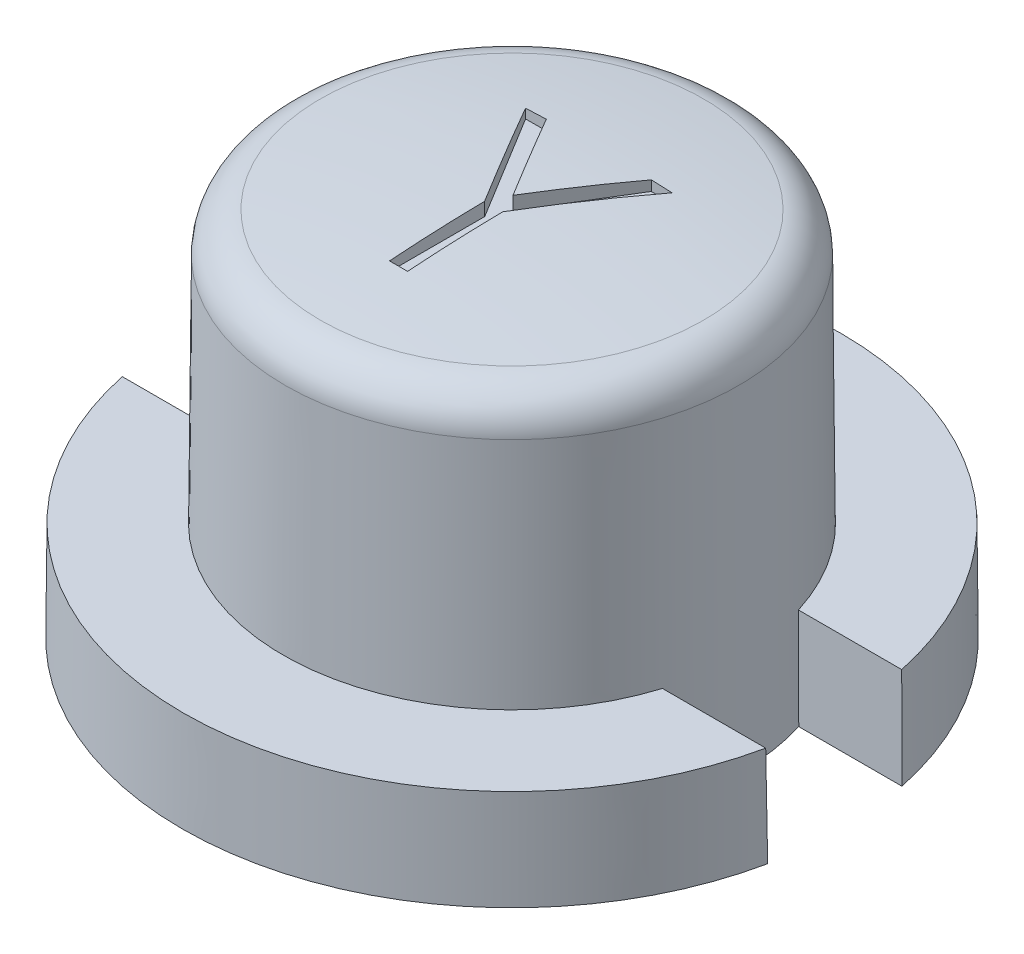
ISO-10303-21;
HEADER;
FILE_DESCRIPTION(('STEP AP214'),'2;1');
FILE_NAME('part.step','',(''),(''),'','','');
FILE_SCHEMA(('AUTOMOTIVE_DESIGN { 1 0 10303 214 1 1 1 1 }'));
ENDSEC;
DATA;
#1=APPLICATION_CONTEXT('core data for automotive mechanical design processes');
#2=APPLICATION_PROTOCOL_DEFINITION('international standard','automotive_design',2000,#1);
#3=PRODUCT_CONTEXT('',#1,'mechanical');
#4=PRODUCT('Part','Part','',(#3));
#5=PRODUCT_RELATED_PRODUCT_CATEGORY('part','',(#4));
#6=PRODUCT_DEFINITION_FORMATION('','',#4);
#7=PRODUCT_DEFINITION_CONTEXT('part definition',#1,'design');
#8=PRODUCT_DEFINITION('design','',#6,#7);
#9=PRODUCT_DEFINITION_SHAPE('','',#8);
#10=(LENGTH_UNIT() NAMED_UNIT(*) SI_UNIT(.MILLI.,.METRE.));
#11=(NAMED_UNIT(*) PLANE_ANGLE_UNIT() SI_UNIT($,.RADIAN.));
#12=(NAMED_UNIT(*) SI_UNIT($,.STERADIAN.) SOLID_ANGLE_UNIT());
#13=UNCERTAINTY_MEASURE_WITH_UNIT(LENGTH_MEASURE(1.E-05),#10,'distance_accuracy_value','');
#14=(GEOMETRIC_REPRESENTATION_CONTEXT(3) GLOBAL_UNCERTAINTY_ASSIGNED_CONTEXT((#13)) GLOBAL_UNIT_ASSIGNED_CONTEXT((#10,
#11,#12)) REPRESENTATION_CONTEXT('',''));
#15=CARTESIAN_POINT('',(0.,0.,0.));
#16=DIRECTION('',(0.,0.,1.));
#17=DIRECTION('',(1.,0.,0.));
#18=AXIS2_PLACEMENT_3D('',#15,#16,#17);
#19=CARTESIAN_POINT('',(0.,4.72622660203488,0.));
#20=DIRECTION('',(0.,-1.,0.));
#21=DIRECTION('',(0.,0.,-1.));
#22=AXIS2_PLACEMENT_3D('',#19,#20,#21);
#23=TOROIDAL_SURFACE('',#22,2.8,0.6);
#24=CARTESIAN_POINT('',(0.,4.72622660203488,2.8));
#25=DIRECTION('',(-1.,0.,0.));
#26=DIRECTION('',(0.,0.,1.));
#27=AXIS2_PLACEMENT_3D('',#24,#25,#26);
#28=CIRCLE('',#27,0.6);
#29=CARTESIAN_POINT('',(0.,4.73669804418101,3.3999086171163));
#30=VERTEX_POINT('',#29);
#31=CARTESIAN_POINT('',(0.,5.32162231681612,2.8741885625966));
#32=VERTEX_POINT('',#31);
#33=EDGE_CURVE('E194',#30,#32,#28,.T.);
#34=ORIENTED_EDGE('',*,*,#33,.F.);
#35=CARTESIAN_POINT('',(0.,4.73669804418101,0.));
#36=DIRECTION('',(0.,-1.,0.));
#37=DIRECTION('',(1.,0.,0.));
#38=AXIS2_PLACEMENT_3D('',#35,#36,#37);
#39=CIRCLE('',#38,3.39990861710881);
#40=EDGE_CURVE('E122',#30,#30,#39,.F.);
#41=ORIENTED_EDGE('',*,*,#40,.T.);
#42=ORIENTED_EDGE('',*,*,#33,.T.);
#43=CARTESIAN_POINT('',(0.,5.32162231681612,0.));
#44=DIRECTION('',(0.,1.,0.));
#45=DIRECTION('',(0.,0.,-1.));
#46=AXIS2_PLACEMENT_3D('',#43,#44,#45);
#47=CIRCLE('',#46,2.8741885625966);
#48=EDGE_CURVE('E190',#32,#32,#47,.T.);
#49=ORIENTED_EDGE('',*,*,#48,.F.);
#50=EDGE_LOOP('',(#34,#41,#42,#49));
#51=FACE_BOUND('',#50,.T.);
#52=ADVANCED_FACE('F44',(#51),#23,.T.);
#53=CARTESIAN_POINT('',(0.,5.3,0.));
#54=DIRECTION('',(0.,1.,0.));
#55=DIRECTION('',(1.,0.,0.));
#56=AXIS2_PLACEMENT_3D('',#53,#54,#55);
#57=PLANE('',#56);
#58=DIRECTION('',(0.521331386880887,0.,0.853354313900651));
#59=VECTOR('',#58,1.);
#60=CARTESIAN_POINT('',(-0.134615384615384,5.3,0.273918269230769));
#61=LINE('',#60,#59);
#62=CARTESIAN_POINT('',(-1.09615384615385,5.3,-1.3));
#63=VERTEX_POINT('',#62);
#64=CARTESIAN_POINT('',(-0.134615384615384,5.3,0.273918269230769));
#65=VERTEX_POINT('',#64);
#66=EDGE_CURVE('E214',#63,#65,#61,.T.);
#67=ORIENTED_EDGE('',*,*,#66,.T.);
#68=DIRECTION('',(0.,0.,1.));
#69=VECTOR('',#68,1.);
#70=CARTESIAN_POINT('',(-0.134615384615384,5.3,1.7));
#71=LINE('',#70,#69);
#72=CARTESIAN_POINT('',(-0.134615384615384,5.3,1.7));
#73=VERTEX_POINT('',#72);
#74=EDGE_CURVE('E200',#65,#73,#71,.T.);
#75=ORIENTED_EDGE('',*,*,#74,.T.);
#76=DIRECTION('',(1.,0.,0.));
#77=VECTOR('',#76,1.);
#78=CARTESIAN_POINT('',(0.134615384615385,5.3,1.7));
#79=LINE('',#78,#77);
#80=CARTESIAN_POINT('',(0.134615384615385,5.3,1.7));
#81=VERTEX_POINT('',#80);
#82=EDGE_CURVE('E209',#73,#81,#79,.T.);
#83=ORIENTED_EDGE('',*,*,#82,.T.);
#84=DIRECTION('',(0.,0.,-1.));
#85=VECTOR('',#84,1.);
#86=CARTESIAN_POINT('',(0.134615384615385,5.3,0.273918269230769));
#87=LINE('',#86,#85);
#88=CARTESIAN_POINT('',(0.134615384615385,5.3,0.273918269230769));
#89=VERTEX_POINT('',#88);
#90=EDGE_CURVE('E195',#81,#89,#87,.T.);
#91=ORIENTED_EDGE('',*,*,#90,.T.);
#92=DIRECTION('',(0.521331386880887,0.,-0.853354313900651));
#93=VECTOR('',#92,1.);
#94=CARTESIAN_POINT('',(1.09615384615385,5.3,-1.3));
#95=LINE('',#94,#93);
#96=CARTESIAN_POINT('',(1.09615384615385,5.3,-1.3));
#97=VERTEX_POINT('',#96);
#98=EDGE_CURVE('E227',#89,#97,#95,.T.);
#99=ORIENTED_EDGE('',*,*,#98,.T.);
#100=DIRECTION('',(-1.,0.,0.));
#101=VECTOR('',#100,1.);
#102=CARTESIAN_POINT('',(0.787860576923077,5.3,-1.3));
#103=LINE('',#102,#101);
#104=CARTESIAN_POINT('',(0.787860576923077,5.3,-1.3));
#105=VERTEX_POINT('',#104);
#106=EDGE_CURVE('E222',#97,#105,#103,.T.);
#107=ORIENTED_EDGE('',*,*,#106,.T.);
#108=DIRECTION('',(-0.521208584832579,0.,0.853429324019758));
#109=VECTOR('',#108,1.);
#110=CARTESIAN_POINT('',(0.000600961538461606,5.3,-0.0109375));
#111=LINE('',#110,#109);
#112=CARTESIAN_POINT('',(0.000600961538461606,5.3,-0.0109375));
#113=VERTEX_POINT('',#112);
#114=EDGE_CURVE('E229',#105,#113,#111,.T.);
#115=ORIENTED_EDGE('',*,*,#114,.T.);
#116=DIRECTION('',(-0.521787793651245,0.,-0.853075318126463));
#117=VECTOR('',#116,1.);
#118=CARTESIAN_POINT('',(-0.787860576923077,5.3,-1.3));
#119=LINE('',#118,#117);
#120=CARTESIAN_POINT('',(-0.787860576923077,5.3,-1.3));
#121=VERTEX_POINT('',#120);
#122=EDGE_CURVE('E204',#113,#121,#119,.T.);
#123=ORIENTED_EDGE('',*,*,#122,.T.);
#124=DIRECTION('',(-1.,0.,0.));
#125=VECTOR('',#124,1.);
#126=CARTESIAN_POINT('',(-1.09615384615385,5.3,-1.3));
#127=LINE('',#126,#125);
#128=EDGE_CURVE('E219',#121,#63,#127,.T.);
#129=ORIENTED_EDGE('',*,*,#128,.T.);
#130=EDGE_LOOP('',(#67,#75,#83,#91,#99,#107,#115,#123,#129));
#131=FACE_BOUND('',#130,.T.);
#132=ADVANCED_FACE('F354',(#131),#57,.T.);
#133=CARTESIAN_POINT('',(-0.134615384615384,5.3,1.7));
#134=DIRECTION('',(0.999961923064171,0.00872653549837395,0.));
#135=DIRECTION('',(-0.00872653549837395,0.999961923064171,0.));
#136=AXIS2_PLACEMENT_3D('',#133,#134,#135);
#137=PLANE('',#136);
#138=CARTESIAN_POINT('',(0.0664902198457663,-17.744419748642,0.));
#139=DIRECTION('',(0.999961923064171,0.00872653549837395,0.));
#140=DIRECTION('',(-0.00872653549837395,0.999961923064171,0.));
#141=AXIS2_PLACEMENT_3D('',#138,#139,#140);
#142=CIRCLE('',#141,23.2449048979335);
#143=CARTESIAN_POINT('',(-0.13634313338616,5.49798039940585,0.274404268942802));
#144=VERTEX_POINT('',#143);
#145=CARTESIAN_POINT('',(-0.135813295982171,5.43726704649473,1.70119791136679));
#146=VERTEX_POINT('',#145);
#147=EDGE_CURVE('E259',#144,#146,#142,.T.);
#148=ORIENTED_EDGE('',*,*,#147,.T.);
#149=DIRECTION('',(-0.00872620324394424,0.99992385047757,0.00872620324394424));
#150=VECTOR('',#149,1.);
#151=CARTESIAN_POINT('',(-0.134615384615384,5.3,1.7));
#152=LINE('',#151,#150);
#153=EDGE_CURVE('E203',#73,#146,#152,.T.);
#154=ORIENTED_EDGE('',*,*,#153,.F.);
#155=ORIENTED_EDGE('',*,*,#74,.F.);
#156=DIRECTION('',(-0.00872650920753413,0.999958910432325,0.00245468614051337));
#157=VECTOR('',#156,1.);
#158=CARTESIAN_POINT('',(-0.134645932485687,5.30350043922231,0.27392686206349));
#159=LINE('',#158,#157);
#160=EDGE_CURVE('E218',#65,#144,#159,.T.);
#161=ORIENTED_EDGE('',*,*,#160,.T.);
#162=EDGE_LOOP('',(#148,#154,#155,#161));
#163=FACE_BOUND('',#162,.T.);
#164=ADVANCED_FACE('F439',(#163),#137,.T.);
#165=CARTESIAN_POINT('',(0.134615384615385,5.3,1.7));
#166=DIRECTION('',(0.,0.00872653549837395,-0.999961923064171));
#167=DIRECTION('',(0.,0.999961923064171,0.00872653549837395));
#168=AXIS2_PLACEMENT_3D('',#165,#166,#167);
#169=PLANE('',#168);
#170=CARTESIAN_POINT('',(0.,-17.7580796129112,1.49877518770933));
#171=DIRECTION('',(0.,0.00872653549837395,-0.999961923064171));
#172=DIRECTION('',(0.,0.999961923064171,0.00872653549837395));
#173=AXIS2_PLACEMENT_3D('',#170,#171,#172);
#174=CIRCLE('',#173,23.1966274889354);
#175=CARTESIAN_POINT('',(0.135813295982172,5.43726704649473,1.70119791136679));
#176=VERTEX_POINT('',#175);
#177=EDGE_CURVE('E193',#146,#176,#174,.T.);
#178=ORIENTED_EDGE('',*,*,#177,.T.);
#179=DIRECTION('',(0.00872620324394424,0.99992385047757,0.00872620324394424));
#180=VECTOR('',#179,1.);
#181=CARTESIAN_POINT('',(0.134615384615385,5.3,1.7));
#182=LINE('',#181,#180);
#183=EDGE_CURVE('E198',#81,#176,#182,.T.);
#184=ORIENTED_EDGE('',*,*,#183,.F.);
#185=ORIENTED_EDGE('',*,*,#82,.F.);
#186=ORIENTED_EDGE('',*,*,#153,.T.);
#187=EDGE_LOOP('',(#178,#184,#185,#186));
#188=FACE_BOUND('',#187,.T.);
#189=ADVANCED_FACE('F450',(#188),#169,.T.);
#190=CARTESIAN_POINT('',(0.134615384615385,5.3,0.273918269230769));
#191=DIRECTION('',(-0.999961923064171,0.00872653549837395,0.));
#192=DIRECTION('',(-0.00872653549837395,-0.999961923064171,0.));
#193=AXIS2_PLACEMENT_3D('',#190,#191,#192);
#194=PLANE('',#193);
#195=CARTESIAN_POINT('',(-0.0664902198457653,-17.744419748642,0.));
#196=DIRECTION('',(-0.999961923064171,0.00872653549837395,0.));
#197=DIRECTION('',(-0.00872653549837395,-0.999961923064171,0.));
#198=AXIS2_PLACEMENT_3D('',#195,#196,#197);
#199=CIRCLE('',#198,23.2449048979335);
#200=CARTESIAN_POINT('',(0.136343133386161,5.49798039940585,0.274404268942806));
#201=VERTEX_POINT('',#200);
#202=EDGE_CURVE('E254',#176,#201,#199,.T.);
#203=ORIENTED_EDGE('',*,*,#202,.T.);
#204=DIRECTION('',(0.00872650920753413,0.999958910432325,0.00245468614051337));
#205=VECTOR('',#204,1.);
#206=CARTESIAN_POINT('',(0.134654893003365,5.30452721284737,0.273929382574047));
#207=LINE('',#206,#205);
#208=EDGE_CURVE('E199',#89,#201,#207,.T.);
#209=ORIENTED_EDGE('',*,*,#208,.F.);
#210=ORIENTED_EDGE('',*,*,#90,.F.);
#211=ORIENTED_EDGE('',*,*,#183,.T.);
#212=EDGE_LOOP('',(#203,#209,#210,#211));
#213=FACE_BOUND('',#212,.T.);
#214=ADVANCED_FACE('F360',(#213),#194,.T.);
#215=CARTESIAN_POINT('',(1.09615384615385,5.3,-1.3));
#216=DIRECTION('',(-0.853321820783201,0.00872653549837395,-0.521311536179123));
#217=DIRECTION('',(-0.521331386880887,0.,0.853354313900651));
#218=AXIS2_PLACEMENT_3D('',#215,#216,#217);
#219=PLANE('',#218);
#220=CARTESIAN_POINT('',(0.0482672854575823,-17.7454936076515,0.0294874596151706));
#221=DIRECTION('',(-0.853321820783201,0.00872653549837395,-0.521311536179123));
#222=DIRECTION('',(-0.521331386880887,0.,0.853354313900651));
#223=AXIS2_PLACEMENT_3D('',#220,#221,#222);
#224=CIRCLE('',#223,23.2449311789739);
#225=CARTESIAN_POINT('',(1.09829385407208,5.43755061820045,-1.30120038605957));
#226=VERTEX_POINT('',#225);
#227=EDGE_CURVE('E250',#201,#226,#224,.T.);
#228=ORIENTED_EDGE('',*,*,#227,.T.);
#229=DIRECTION('',(0.0155554918113476,0.999840933688733,-0.00872547964009042));
#230=VECTOR('',#229,1.);
#231=CARTESIAN_POINT('',(1.09615384615385,5.3,-1.3));
#232=LINE('',#231,#230);
#233=EDGE_CURVE('E225',#97,#226,#232,.T.);
#234=ORIENTED_EDGE('',*,*,#233,.F.);
#235=ORIENTED_EDGE('',*,*,#98,.F.);
#236=ORIENTED_EDGE('',*,*,#208,.T.);
#237=EDGE_LOOP('',(#228,#234,#235,#236));
#238=FACE_BOUND('',#237,.T.);
#239=ADVANCED_FACE('F365',(#238),#219,.T.);
#240=CARTESIAN_POINT('',(0.787860576923077,5.3,-1.3));
#241=DIRECTION('',(0.,0.00872653549837395,0.999961923064171));
#242=DIRECTION('',(0.,-0.999961923064171,0.00872653549837395));
#243=AXIS2_PLACEMENT_3D('',#240,#241,#242);
#244=PLANE('',#243);
#245=CARTESIAN_POINT('',(0.,-17.7545891316238,-1.09880564867805));
#246=DIRECTION('',(0.,0.00872653549837395,0.999961923064171));
#247=DIRECTION('',(0.,-0.999961923064171,0.00872653549837395));
#248=AXIS2_PLACEMENT_3D('',#245,#246,#247);
#249=CIRCLE('',#248,23.2190128815802);
#250=CARTESIAN_POINT('',(0.787125231650415,5.45019452945821,-1.30131072780148));
#251=VERTEX_POINT('',#250);
#252=EDGE_CURVE('E247',#226,#251,#249,.T.);
#253=ORIENTED_EDGE('',*,*,#252,.T.);
#254=DIRECTION('',(-0.00489570734395077,0.99994993947348,-0.00872643091916233));
#255=VECTOR('',#254,1.);
#256=CARTESIAN_POINT('',(0.787860576923077,5.3,-1.3));
#257=LINE('',#256,#255);
#258=EDGE_CURVE('E226',#105,#251,#257,.T.);
#259=ORIENTED_EDGE('',*,*,#258,.F.);
#260=ORIENTED_EDGE('',*,*,#106,.F.);
#261=ORIENTED_EDGE('',*,*,#233,.T.);
#262=EDGE_LOOP('',(#253,#259,#260,#261));
#263=FACE_BOUND('',#262,.T.);
#264=ADVANCED_FACE('F371',(#263),#244,.T.);
#265=CARTESIAN_POINT('',(0.000600961538461606,5.3,-0.0109375));
#266=DIRECTION('',(0.853396828046153,0.00872653549837395,0.521188738806741));
#267=DIRECTION('',(0.521208584832579,0.,-0.853429324019758));
#268=AXIS2_PLACEMENT_3D('',#265,#266,#267);
#269=PLANE('',#268);
#270=CARTESIAN_POINT('',(0.167193553104682,-17.7432903375917,0.102108883248081));
#271=DIRECTION('',(0.853396828046153,0.00872653549837395,0.521188738806741));
#272=DIRECTION('',(0.521208584832579,0.,-0.853429324019758));
#273=AXIS2_PLACEMENT_3D('',#270,#271,#272);
#274=CIRCLE('',#273,23.2441743705561);
#275=CARTESIAN_POINT('',(0.000599825602937207,5.49999560335111,-0.0142842709459387));
#276=VERTEX_POINT('',#275);
#277=EDGE_CURVE('E251',#251,#276,#274,.T.);
#278=ORIENTED_EDGE('',*,*,#277,.T.);
#279=DIRECTION('',(-5.67900738099159E-06,0.99986001228115,-0.0167318800165486));
#280=VECTOR('',#279,1.);
#281=CARTESIAN_POINT('',(0.0006008390257083,5.32156989681932,-0.0112984554548814));
#282=LINE('',#281,#280);
#283=EDGE_CURVE('E207',#113,#276,#282,.T.);
#284=ORIENTED_EDGE('',*,*,#283,.F.);
#285=ORIENTED_EDGE('',*,*,#114,.F.);
#286=ORIENTED_EDGE('',*,*,#258,.T.);
#287=EDGE_LOOP('',(#278,#284,#285,#286));
#288=FACE_BOUND('',#287,.T.);
#289=ADVANCED_FACE('F374',(#288),#269,.T.);
#290=CARTESIAN_POINT('',(-0.787860576923077,5.3,-1.3));
#291=DIRECTION('',(-0.853042835632318,0.00872653549837395,0.52176792557091));
#292=DIRECTION('',(0.521787793651245,0.,0.853075318126463));
#293=AXIS2_PLACEMENT_3D('',#290,#291,#292);
#294=PLANE('',#293);
#295=CARTESIAN_POINT('',(-0.166243997291302,-17.7432993419754,0.101683974100787));
#296=DIRECTION('',(-0.853042835632318,0.00872653549837395,0.52176792557091));
#297=DIRECTION('',(0.521787793651245,0.,0.853075318126463));
#298=AXIS2_PLACEMENT_3D('',#295,#296,#297);
#299=CIRCLE('',#298,23.2441830445929);
#300=CARTESIAN_POINT('',(-0.787125816535855,5.45019450961992,-1.30131072762835));
#301=VERTEX_POINT('',#300);
#302=EDGE_CURVE('E268',#276,#301,#299,.T.);
#303=ORIENTED_EDGE('',*,*,#302,.T.);
#304=DIRECTION('',(0.00489181409219273,0.999949958525625,-0.00872643108542788));
#305=VECTOR('',#304,1.);
#306=CARTESIAN_POINT('',(-0.787860576923077,5.3,-1.3));
#307=LINE('',#306,#305);
#308=EDGE_CURVE('E208',#121,#301,#307,.T.);
#309=ORIENTED_EDGE('',*,*,#308,.F.);
#310=ORIENTED_EDGE('',*,*,#122,.F.);
#311=ORIENTED_EDGE('',*,*,#283,.T.);
#312=EDGE_LOOP('',(#303,#309,#310,#311));
#313=FACE_BOUND('',#312,.T.);
#314=ADVANCED_FACE('F377',(#313),#294,.T.);
#315=CARTESIAN_POINT('',(-1.09615384615385,5.3,-1.3));
#316=DIRECTION('',(0.,0.00872653549837395,0.999961923064171));
#317=DIRECTION('',(0.,-0.999961923064171,0.00872653549837395));
#318=AXIS2_PLACEMENT_3D('',#315,#316,#317);
#319=PLANE('',#318);
#320=CARTESIAN_POINT('',(0.,-17.7545891316238,-1.09880564867805));
#321=DIRECTION('',(0.,0.00872653549837395,0.999961923064171));
#322=DIRECTION('',(0.,-0.999961923064171,0.00872653549837395));
#323=AXIS2_PLACEMENT_3D('',#320,#321,#322);
#324=CIRCLE('',#323,23.2190128815802);
#325=CARTESIAN_POINT('',(-1.09829385407208,5.43755061820045,-1.30120038605957));
#326=VERTEX_POINT('',#325);
#327=EDGE_CURVE('E265',#301,#326,#324,.T.);
#328=ORIENTED_EDGE('',*,*,#327,.T.);
#329=DIRECTION('',(-0.0155554918113476,0.999840933688733,-0.00872547964009042));
#330=VECTOR('',#329,1.);
#331=CARTESIAN_POINT('',(-1.09615384615385,5.3,-1.3));
#332=LINE('',#331,#330);
#333=EDGE_CURVE('E217',#63,#326,#332,.T.);
#334=ORIENTED_EDGE('',*,*,#333,.F.);
#335=ORIENTED_EDGE('',*,*,#128,.F.);
#336=ORIENTED_EDGE('',*,*,#308,.T.);
#337=EDGE_LOOP('',(#328,#334,#335,#336));
#338=FACE_BOUND('',#337,.T.);
#339=ADVANCED_FACE('F383',(#338),#319,.T.);
#340=CARTESIAN_POINT('',(-0.134615384615384,5.3,0.273918269230769));
#341=DIRECTION('',(0.853321820783201,0.00872653549837395,-0.521311536179123));
#342=DIRECTION('',(-0.521331386880887,0.,-0.853354313900651));
#343=AXIS2_PLACEMENT_3D('',#340,#341,#342);
#344=PLANE('',#343);
#345=CARTESIAN_POINT('',(-0.0482672854575798,-17.7454936076515,0.0294874596151691));
#346=DIRECTION('',(0.853321820783201,0.00872653549837395,-0.521311536179123));
#347=DIRECTION('',(-0.521331386880887,0.,-0.853354313900651));
#348=AXIS2_PLACEMENT_3D('',#345,#346,#347);
#349=CIRCLE('',#348,23.2449311789739);
#350=EDGE_CURVE('E262',#326,#144,#349,.T.);
#351=ORIENTED_EDGE('',*,*,#350,.T.);
#352=ORIENTED_EDGE('',*,*,#160,.F.);
#353=ORIENTED_EDGE('',*,*,#66,.F.);
#354=ORIENTED_EDGE('',*,*,#333,.T.);
#355=EDGE_LOOP('',(#351,#352,#353,#354));
#356=FACE_BOUND('',#355,.T.);
#357=ADVANCED_FACE('F387',(#356),#344,.T.);
#358=CARTESIAN_POINT('',(0.,-17.745,0.));
#359=DIRECTION('',(-1.,0.,0.));
#360=DIRECTION('',(0.,0.,1.));
#361=AXIS2_PLACEMENT_3D('',#358,#359,#360);
#362=SPHERICAL_SURFACE('',#361,23.245);
#363=ORIENTED_EDGE('',*,*,#177,.F.);
#364=ORIENTED_EDGE('',*,*,#147,.F.);
#365=ORIENTED_EDGE('',*,*,#350,.F.);
#366=ORIENTED_EDGE('',*,*,#327,.F.);
#367=ORIENTED_EDGE('',*,*,#302,.F.);
#368=ORIENTED_EDGE('',*,*,#277,.F.);
#369=ORIENTED_EDGE('',*,*,#252,.F.);
#370=ORIENTED_EDGE('',*,*,#227,.F.);
#371=ORIENTED_EDGE('',*,*,#202,.F.);
#372=EDGE_LOOP('',(#363,#364,#365,#366,#367,#368,#369,#370,#371));
#373=FACE_BOUND('',#372,.T.);
#374=ORIENTED_EDGE('',*,*,#48,.T.);
#375=EDGE_LOOP('',(#374));
#376=FACE_BOUND('',#375,.T.);
#377=ADVANCED_FACE('F442',(#373,#376),#362,.T.);
#378=CARTESIAN_POINT('',(0.,-0.25,0.));
#379=DIRECTION('',(0.,1.,0.));
#380=DIRECTION('',(1.,0.,0.));
#381=AXIS2_PLACEMENT_3D('',#378,#379,#380);
#382=PLANE('',#381);
#383=CARTESIAN_POINT('',(0.,-0.25,0.));
#384=DIRECTION('',(0.,1.,0.));
#385=DIRECTION('',(0.,0.,1.));
#386=AXIS2_PLACEMENT_3D('',#383,#384,#385);
#387=CIRCLE('',#386,2.08803388987904);
#388=CARTESIAN_POINT('',(0.,-0.25,2.08803388987904));
#389=VERTEX_POINT('',#388);
#390=EDGE_CURVE('E271',#389,#389,#387,.T.);
#391=ORIENTED_EDGE('',*,*,#390,.T.);
#392=EDGE_LOOP('',(#391));
#393=FACE_BOUND('',#392,.T.);
#394=CARTESIAN_POINT('',(0.,-0.25,0.));
#395=DIRECTION('',(0.,1.,0.));
#396=DIRECTION('',(0.,0.,1.));
#397=AXIS2_PLACEMENT_3D('',#394,#395,#396);
#398=CIRCLE('',#397,3.44342687165278);
#399=CARTESIAN_POINT('',(3.29303135116183,-0.25,-1.00654515084307));
#400=VERTEX_POINT('',#399);
#401=CARTESIAN_POINT('',(3.29303135116184,-0.25,1.00654515084307));
#402=VERTEX_POINT('',#401);
#403=EDGE_CURVE('E121',#400,#402,#398,.F.);
#404=ORIENTED_EDGE('',*,*,#403,.T.);
#405=DIRECTION('',(1.,0.,0.));
#406=VECTOR('',#405,1.);
#407=CARTESIAN_POINT('',(-4.84790913936014,-0.25,1.00654515084307));
#408=LINE('',#407,#406);
#409=CARTESIAN_POINT('',(4.83986942950872,-0.25,1.00654515084307));
#410=VERTEX_POINT('',#409);
#411=EDGE_CURVE('E283',#402,#410,#408,.T.);
#412=ORIENTED_EDGE('',*,*,#411,.T.);
#413=CARTESIAN_POINT('',(0.,-0.25,0.));
#414=DIRECTION('',(0.,1.,0.));
#415=DIRECTION('',(0.,0.,1.));
#416=AXIS2_PLACEMENT_3D('',#413,#414,#415);
#417=CIRCLE('',#416,4.94342687165277);
#418=CARTESIAN_POINT('',(-4.83986942950872,-0.25,1.00654515084307));
#419=VERTEX_POINT('',#418);
#420=EDGE_CURVE('E274',#410,#419,#417,.F.);
#421=ORIENTED_EDGE('',*,*,#420,.T.);
#422=DIRECTION('',(1.,0.,0.));
#423=VECTOR('',#422,1.);
#424=CARTESIAN_POINT('',(-4.84790913936014,-0.25,1.00654515084307));
#425=LINE('',#424,#423);
#426=CARTESIAN_POINT('',(-3.29303135116183,-0.25,1.00654515084307));
#427=VERTEX_POINT('',#426);
#428=EDGE_CURVE('E63',#419,#427,#425,.T.);
#429=ORIENTED_EDGE('',*,*,#428,.T.);
#430=CARTESIAN_POINT('',(0.,-0.25,0.));
#431=DIRECTION('',(0.,1.,0.));
#432=DIRECTION('',(0.,0.,1.));
#433=AXIS2_PLACEMENT_3D('',#430,#431,#432);
#434=CIRCLE('',#433,3.44342687165278);
#435=CARTESIAN_POINT('',(-3.29303135116184,-0.25,-1.00654515084307));
#436=VERTEX_POINT('',#435);
#437=EDGE_CURVE('E111',#427,#436,#434,.F.);
#438=ORIENTED_EDGE('',*,*,#437,.T.);
#439=DIRECTION('',(-1.,0.,0.));
#440=VECTOR('',#439,1.);
#441=CARTESIAN_POINT('',(-4.84790913936014,-0.25,-1.00654515084307));
#442=LINE('',#441,#440);
#443=CARTESIAN_POINT('',(-4.83986942950872,-0.25,-1.00654515084307));
#444=VERTEX_POINT('',#443);
#445=EDGE_CURVE('E116',#436,#444,#442,.T.);
#446=ORIENTED_EDGE('',*,*,#445,.T.);
#447=CARTESIAN_POINT('',(0.,-0.25,0.));
#448=DIRECTION('',(0.,1.,0.));
#449=DIRECTION('',(0.,0.,1.));
#450=AXIS2_PLACEMENT_3D('',#447,#448,#449);
#451=CIRCLE('',#450,4.94342687165277);
#452=CARTESIAN_POINT('',(4.83986942950872,-0.25,-1.00654515084307));
#453=VERTEX_POINT('',#452);
#454=EDGE_CURVE('E131',#444,#453,#451,.F.);
#455=ORIENTED_EDGE('',*,*,#454,.T.);
#456=DIRECTION('',(-1.,0.,0.));
#457=VECTOR('',#456,1.);
#458=CARTESIAN_POINT('',(-4.84790913936014,-0.25,-1.00654515084307));
#459=LINE('',#458,#457);
#460=EDGE_CURVE('E130',#453,#400,#459,.T.);
#461=ORIENTED_EDGE('',*,*,#460,.T.);
#462=EDGE_LOOP('',(#404,#412,#421,#429,#438,#446,#455,#461));
#463=FACE_BOUND('',#462,.T.);
#464=ADVANCED_FACE('F114',(#393,#463),#382,.F.);
#465=CARTESIAN_POINT('',(0.,4.72622660203488,0.));
#466=DIRECTION('',(0.,-1.,0.));
#467=DIRECTION('',(1.,0.,0.));
#468=AXIS2_PLACEMENT_3D('',#465,#466,#467);
#469=CONICAL_SURFACE('',#468,3.4,0.00872664625996436);
#470=CARTESIAN_POINT('',(0.,1.25,0.));
#471=DIRECTION('',(0.,-1.,0.));
#472=DIRECTION('',(0.,0.,-1.));
#473=AXIS2_PLACEMENT_3D('',#470,#471,#472);
#474=CIRCLE('',#473,3.43033656996665);
#475=CARTESIAN_POINT('',(3.27529426574104,1.25,1.01963545252921));
#476=VERTEX_POINT('',#475);
#477=CARTESIAN_POINT('',(-3.27529426574104,1.25,1.01963545252921));
#478=VERTEX_POINT('',#477);
#479=EDGE_CURVE('E137',#476,#478,#474,.T.);
#480=ORIENTED_EDGE('',*,*,#479,.F.);
#481=CARTESIAN_POINT('',(3.26973350285921,1.71859774816533,1.02372484312449));
#482=CARTESIAN_POINT('',(3.27653711266679,1.14573232412735,1.01872552230702));
#483=CARTESIAN_POINT('',(3.28331987905421,0.572866654079152,1.01372619934264));
#484=CARTESIAN_POINT('',(3.2968437249887,-0.572865178031069,1.00372754912015));
#485=CARTESIAN_POINT('',(3.30358480453575,-1.14573134009309,0.998728221862038));
#486=CARTESIAN_POINT('',(3.31030504066266,-1.71859774816533,0.993728892457024));
#487=B_SPLINE_CURVE_WITH_KNOTS('',3,(#481,#482,#483,#484,#485,#486),.UNSPECIFIED.,.F.,.F.,(4,2,
4),(0.,1.71878290532215,3.43756581062447),.UNSPECIFIED.);
#488=EDGE_CURVE('E12',#476,#402,#487,.T.);
#489=ORIENTED_EDGE('',*,*,#488,.T.);
#490=ORIENTED_EDGE('',*,*,#403,.F.);
#491=CARTESIAN_POINT('',(3.31030504066266,-1.71859774816533,-0.993728892457024));
#492=CARTESIAN_POINT('',(3.30358480453575,-1.14573134009309,-0.998728221862038));
#493=CARTESIAN_POINT('',(3.2968437249887,-0.572865178031069,-1.00372754912015));
#494=CARTESIAN_POINT('',(3.28331987905421,0.572866654079152,-1.01372619934264));
#495=CARTESIAN_POINT('',(3.27653711266679,1.14573232412735,-1.01872552230702));
#496=CARTESIAN_POINT('',(3.26973350285921,1.71859774816533,-1.02372484312449));
#497=B_SPLINE_CURVE_WITH_KNOTS('',3,(#491,#492,#493,#494,#495,#496),.UNSPECIFIED.,.F.,.F.,(4,2,
4),(0.,1.71878290530232,3.43756581062447),.UNSPECIFIED.);
#498=CARTESIAN_POINT('',(3.27529426574104,1.25,-1.01963545252921));
#499=VERTEX_POINT('',#498);
#500=EDGE_CURVE('E138',#400,#499,#497,.T.);
#501=ORIENTED_EDGE('',*,*,#500,.T.);
#502=CARTESIAN_POINT('',(0.,1.25,0.));
#503=DIRECTION('',(0.,-1.,0.));
#504=DIRECTION('',(0.,0.,-1.));
#505=AXIS2_PLACEMENT_3D('',#502,#503,#504);
#506=CIRCLE('',#505,3.43033656996665);
#507=CARTESIAN_POINT('',(-3.27529426574104,1.25,-1.01963545252921));
#508=VERTEX_POINT('',#507);
#509=EDGE_CURVE('E48',#508,#499,#506,.T.);
#510=ORIENTED_EDGE('',*,*,#509,.F.);
#511=CARTESIAN_POINT('',(-3.26973350285921,1.71859774816533,-1.02372484312449));
#512=CARTESIAN_POINT('',(-3.27653711266679,1.14573232412735,-1.01872552230702));
#513=CARTESIAN_POINT('',(-3.28331987905421,0.572866654079152,-1.01372619934264));
#514=CARTESIAN_POINT('',(-3.2968437249887,-0.572865178031069,-1.00372754912015));
#515=CARTESIAN_POINT('',(-3.30358480453575,-1.14573134009309,-0.998728221862038));
#516=CARTESIAN_POINT('',(-3.31030504066266,-1.71859774816533,-0.993728892457024));
#517=B_SPLINE_CURVE_WITH_KNOTS('',3,(#511,#512,#513,#514,#515,#516),.UNSPECIFIED.,.F.,.F.,(4,2,
4),(0.,1.71878290532215,3.43756581062447),.UNSPECIFIED.);
#518=EDGE_CURVE('E126',#508,#436,#517,.T.);
#519=ORIENTED_EDGE('',*,*,#518,.T.);
#520=ORIENTED_EDGE('',*,*,#437,.F.);
#521=CARTESIAN_POINT('',(-3.31030504066266,-1.71859774816533,0.993728892457024));
#522=CARTESIAN_POINT('',(-3.30358480453575,-1.14573134009309,0.998728221862038));
#523=CARTESIAN_POINT('',(-3.2968437249887,-0.572865178031069,1.00372754912015));
#524=CARTESIAN_POINT('',(-3.28331987905421,0.572866654079152,1.01372619934264));
#525=CARTESIAN_POINT('',(-3.27653711266679,1.14573232412735,1.01872552230702));
#526=CARTESIAN_POINT('',(-3.26973350285921,1.71859774816533,1.02372484312449));
#527=B_SPLINE_CURVE_WITH_KNOTS('',3,(#521,#522,#523,#524,#525,#526),.UNSPECIFIED.,.F.,.F.,(4,2,
4),(0.,1.71878290530232,3.43756581062447),.UNSPECIFIED.);
#528=EDGE_CURVE('E54',#427,#478,#527,.T.);
#529=ORIENTED_EDGE('',*,*,#528,.T.);
#530=EDGE_LOOP('',(#480,#489,#490,#501,#510,#519,#520,#529));
#531=FACE_BOUND('',#530,.T.);
#532=ORIENTED_EDGE('',*,*,#40,.F.);
#533=EDGE_LOOP('',(#532));
#534=FACE_BOUND('',#533,.T.);
#535=ADVANCED_FACE('F134',(#531,#534),#469,.T.);
#536=CARTESIAN_POINT('',(-4.84790913936014,-1.,-1.));
#537=DIRECTION('',(0.,0.00872653549837395,0.999961923064171));
#538=DIRECTION('',(0.,-0.999961923064171,0.00872653549837395));
#539=AXIS2_PLACEMENT_3D('',#536,#537,#538);
#540=PLANE('',#539);
#541=ORIENTED_EDGE('',*,*,#518,.F.);
#542=DIRECTION('',(-1.,0.,0.));
#543=VECTOR('',#542,1.);
#544=CARTESIAN_POINT('',(0.,1.25,-1.01963545252921));
#545=LINE('',#544,#543);
#546=CARTESIAN_POINT('',(-4.82374981078994,1.25,-1.01963545252921));
#547=VERTEX_POINT('',#546);
#548=EDGE_CURVE('E296',#508,#547,#545,.T.);
#549=ORIENTED_EDGE('',*,*,#548,.T.);
#550=CARTESIAN_POINT('',(-4.78205311615585,5.10684322329632,-1.0532936134286));
#551=CARTESIAN_POINT('',(-4.7969165201097,3.73789621162842,-1.04134699384522));
#552=CARTESIAN_POINT('',(-4.8117121989267,2.36894847052964,-1.02940036789619));
#553=CARTESIAN_POINT('',(-4.83361254327773,0.333333506325801,-1.01163582523069));
#554=CARTESIAN_POINT('',(-4.84076887219549,-0.333333160340866,-1.00581791337019));
#555=CARTESIAN_POINT('',(-4.84790913936014,-1.,-1.));
#556=B_SPLINE_CURVE_WITH_KNOTS('',3,(#550,#551,#552,#553,#554,#555),.UNSPECIFIED.,.F.,.F.,(4,2,
4),(0.,4.10723945814995,6.10743083656302),.UNSPECIFIED.);
#557=EDGE_CURVE('E128',#547,#444,#556,.T.);
#558=ORIENTED_EDGE('',*,*,#557,.T.);
#559=ORIENTED_EDGE('',*,*,#445,.F.);
#560=EDGE_LOOP('',(#541,#549,#558,#559));
#561=FACE_BOUND('',#560,.T.);
#562=ADVANCED_FACE('F125',(#561),#540,.T.);
#563=ORIENTED_EDGE('',*,*,#500,.F.);
#564=ORIENTED_EDGE('',*,*,#460,.F.);
#565=CARTESIAN_POINT('',(4.78205311615585,5.10684322329632,-1.0532936134286));
#566=CARTESIAN_POINT('',(4.7969165201097,3.73789621162842,-1.04134699384522));
#567=CARTESIAN_POINT('',(4.8117121989267,2.36894847052964,-1.02940036789619));
#568=CARTESIAN_POINT('',(4.83361254327773,0.333333506325801,-1.01163582523069));
#569=CARTESIAN_POINT('',(4.84076887219549,-0.333333160340866,-1.00581791337019));
#570=CARTESIAN_POINT('',(4.84790913936014,-1.,-1.));
#571=B_SPLINE_CURVE_WITH_KNOTS('',3,(#565,#566,#567,#568,#569,#570),.UNSPECIFIED.,.F.,.F.,(4,2,
4),(0.,4.10723945814995,6.10743083656302),.UNSPECIFIED.);
#572=CARTESIAN_POINT('',(4.82374981078994,1.25,-1.01963545252921));
#573=VERTEX_POINT('',#572);
#574=EDGE_CURVE('E180',#573,#453,#571,.T.);
#575=ORIENTED_EDGE('',*,*,#574,.F.);
#576=DIRECTION('',(-1.,0.,0.));
#577=VECTOR('',#576,1.);
#578=CARTESIAN_POINT('',(0.,1.25,-1.01963545252921));
#579=LINE('',#578,#577);
#580=EDGE_CURVE('E187',#573,#499,#579,.T.);
#581=ORIENTED_EDGE('',*,*,#580,.T.);
#582=EDGE_LOOP('',(#563,#564,#575,#581));
#583=FACE_BOUND('',#582,.T.);
#584=ADVANCED_FACE('F165',(#583),#540,.T.);
#585=CARTESIAN_POINT('',(0.,-1.,0.));
#586=DIRECTION('',(0.,-1.,0.));
#587=DIRECTION('',(0.,0.,-1.));
#588=AXIS2_PLACEMENT_3D('',#585,#586,#587);
#589=CONICAL_SURFACE('',#588,4.94997202249584,0.00872664625997167);
#590=ORIENTED_EDGE('',*,*,#454,.F.);
#591=ORIENTED_EDGE('',*,*,#557,.F.);
#592=CARTESIAN_POINT('',(0.,1.25,0.));
#593=DIRECTION('',(0.,-1.,0.));
#594=DIRECTION('',(0.,0.,-1.));
#595=AXIS2_PLACEMENT_3D('',#592,#593,#594);
#596=CIRCLE('',#595,4.93033656996664);
#597=EDGE_CURVE('E278',#547,#573,#596,.T.);
#598=ORIENTED_EDGE('',*,*,#597,.T.);
#599=ORIENTED_EDGE('',*,*,#574,.T.);
#600=EDGE_LOOP('',(#590,#591,#598,#599));
#601=FACE_BOUND('',#600,.T.);
#602=ADVANCED_FACE('F168',(#601),#589,.T.);
#603=CARTESIAN_POINT('',(0.,1.25,0.));
#604=DIRECTION('',(0.,-1.,0.));
#605=DIRECTION('',(0.,0.,-1.));
#606=AXIS2_PLACEMENT_3D('',#603,#604,#605);
#607=PLANE('',#606);
#608=ORIENTED_EDGE('',*,*,#548,.F.);
#609=ORIENTED_EDGE('',*,*,#509,.T.);
#610=ORIENTED_EDGE('',*,*,#580,.F.);
#611=ORIENTED_EDGE('',*,*,#597,.F.);
#612=EDGE_LOOP('',(#608,#609,#610,#611));
#613=FACE_BOUND('',#612,.T.);
#614=ADVANCED_FACE('F46',(#613),#607,.F.);
#615=CARTESIAN_POINT('',(-4.84790913936014,-1.,1.));
#616=DIRECTION('',(0.,0.00872653549837395,-0.999961923064171));
#617=DIRECTION('',(0.,0.999961923064171,0.00872653549837395));
#618=AXIS2_PLACEMENT_3D('',#615,#616,#617);
#619=PLANE('',#618);
#620=ORIENTED_EDGE('',*,*,#488,.F.);
#621=DIRECTION('',(1.,0.,0.));
#622=VECTOR('',#621,1.);
#623=CARTESIAN_POINT('',(0.,1.25,1.01963545252921));
#624=LINE('',#623,#622);
#625=CARTESIAN_POINT('',(4.82374981078994,1.25,1.01963545252921));
#626=VERTEX_POINT('',#625);
#627=EDGE_CURVE('E288',#476,#626,#624,.T.);
#628=ORIENTED_EDGE('',*,*,#627,.T.);
#629=CARTESIAN_POINT('',(4.78205311615585,5.10684322329632,1.0532936134286));
#630=CARTESIAN_POINT('',(4.7969165201097,3.73789621162842,1.04134699384522));
#631=CARTESIAN_POINT('',(4.8117121989267,2.36894847052964,1.02940036789619));
#632=CARTESIAN_POINT('',(4.83361254327773,0.333333506325801,1.01163582523069));
#633=CARTESIAN_POINT('',(4.84076887219549,-0.333333160340866,1.00581791337019));
#634=CARTESIAN_POINT('',(4.84790913936014,-1.,1.));
#635=B_SPLINE_CURVE_WITH_KNOTS('',3,(#629,#630,#631,#632,#633,#634),.UNSPECIFIED.,.F.,.F.,(4,2,
4),(0.,4.10723945814995,6.10743083656302),.UNSPECIFIED.);
#636=EDGE_CURVE('E279',#626,#410,#635,.T.);
#637=ORIENTED_EDGE('',*,*,#636,.T.);
#638=ORIENTED_EDGE('',*,*,#411,.F.);
#639=EDGE_LOOP('',(#620,#628,#637,#638));
#640=FACE_BOUND('',#639,.T.);
#641=ADVANCED_FACE('F397',(#640),#619,.T.);
#642=ORIENTED_EDGE('',*,*,#528,.F.);
#643=ORIENTED_EDGE('',*,*,#428,.F.);
#644=CARTESIAN_POINT('',(-4.78205311615585,5.10684322329632,1.0532936134286));
#645=CARTESIAN_POINT('',(-4.7969165201097,3.73789621162842,1.04134699384522));
#646=CARTESIAN_POINT('',(-4.8117121989267,2.36894847052964,1.02940036789619));
#647=CARTESIAN_POINT('',(-4.83361254327773,0.333333506325801,1.01163582523069));
#648=CARTESIAN_POINT('',(-4.84076887219549,-0.333333160340866,1.00581791337019));
#649=CARTESIAN_POINT('',(-4.84790913936014,-1.,1.));
#650=B_SPLINE_CURVE_WITH_KNOTS('',3,(#644,#645,#646,#647,#648,#649),.UNSPECIFIED.,.F.,.F.,(4,2,
4),(0.,4.10723945814995,6.10743083656302),.UNSPECIFIED.);
#651=CARTESIAN_POINT('',(-4.82374981078994,1.25,1.01963545252921));
#652=VERTEX_POINT('',#651);
#653=EDGE_CURVE('E294',#652,#419,#650,.T.);
#654=ORIENTED_EDGE('',*,*,#653,.F.);
#655=DIRECTION('',(1.,0.,0.));
#656=VECTOR('',#655,1.);
#657=CARTESIAN_POINT('',(0.,1.25,1.01963545252921));
#658=LINE('',#657,#656);
#659=EDGE_CURVE('E290',#652,#478,#658,.T.);
#660=ORIENTED_EDGE('',*,*,#659,.T.);
#661=EDGE_LOOP('',(#642,#643,#654,#660));
#662=FACE_BOUND('',#661,.T.);
#663=ADVANCED_FACE('F401',(#662),#619,.T.);
#664=CARTESIAN_POINT('',(0.,-1.,0.));
#665=DIRECTION('',(0.,-1.,0.));
#666=DIRECTION('',(0.,0.,-1.));
#667=AXIS2_PLACEMENT_3D('',#664,#665,#666);
#668=CONICAL_SURFACE('',#667,4.94997202249584,0.00872664625997167);
#669=ORIENTED_EDGE('',*,*,#420,.F.);
#670=ORIENTED_EDGE('',*,*,#636,.F.);
#671=CARTESIAN_POINT('',(0.,1.25,0.));
#672=DIRECTION('',(0.,-1.,0.));
#673=DIRECTION('',(0.,0.,-1.));
#674=AXIS2_PLACEMENT_3D('',#671,#672,#673);
#675=CIRCLE('',#674,4.93033656996664);
#676=EDGE_CURVE('E282',#626,#652,#675,.T.);
#677=ORIENTED_EDGE('',*,*,#676,.T.);
#678=ORIENTED_EDGE('',*,*,#653,.T.);
#679=EDGE_LOOP('',(#669,#670,#677,#678));
#680=FACE_BOUND('',#679,.T.);
#681=ADVANCED_FACE('F166',(#680),#668,.T.);
#682=CARTESIAN_POINT('',(0.,1.25,0.));
#683=DIRECTION('',(0.,-1.,0.));
#684=DIRECTION('',(0.,0.,-1.));
#685=AXIS2_PLACEMENT_3D('',#682,#683,#684);
#686=PLANE('',#685);
#687=ORIENTED_EDGE('',*,*,#627,.F.);
#688=ORIENTED_EDGE('',*,*,#479,.T.);
#689=ORIENTED_EDGE('',*,*,#659,.F.);
#690=ORIENTED_EDGE('',*,*,#676,.F.);
#691=EDGE_LOOP('',(#687,#688,#689,#690));
#692=FACE_BOUND('',#691,.T.);
#693=ADVANCED_FACE('F424',(#692),#686,.F.);
#694=CARTESIAN_POINT('',(0.,0.273131182477281,0.));
#695=DIRECTION('',(0.,-1.,0.));
#696=DIRECTION('',(0.,0.,-1.));
#697=AXIS2_PLACEMENT_3D('',#694,#695,#696);
#698=CONICAL_SURFACE('',#697,1.71436875953812,0.620249485982822);
#699=CARTESIAN_POINT('',(0.,0.0231311824772807,0.));
#700=DIRECTION('',(0.,1.,0.));
#701=DIRECTION('',(0.,0.,1.));
#702=AXIS2_PLACEMENT_3D('',#699,#700,#701);
#703=CIRCLE('',#702,1.89294018810955);
#704=CARTESIAN_POINT('',(0.,0.0231311824772807,1.89294018810955));
#705=VERTEX_POINT('',#704);
#706=EDGE_CURVE('E275',#705,#705,#703,.T.);
#707=ORIENTED_EDGE('',*,*,#706,.T.);
#708=EDGE_LOOP('',(#707));
#709=FACE_BOUND('',#708,.T.);
#710=ORIENTED_EDGE('',*,*,#390,.F.);
#711=EDGE_LOOP('',(#710));
#712=FACE_BOUND('',#711,.T.);
#713=ADVANCED_FACE('F403',(#709,#712),#698,.F.);
#714=CARTESIAN_POINT('',(-1.71436875953812,0.0231311824772807,0.));
#715=DIRECTION('',(0.,1.,0.));
#716=DIRECTION('',(0.,0.,1.));
#717=AXIS2_PLACEMENT_3D('',#714,#715,#716);
#718=PLANE('',#717);
#719=ORIENTED_EDGE('',*,*,#706,.F.);
#720=EDGE_LOOP('',(#719));
#721=FACE_BOUND('',#720,.T.);
#722=ADVANCED_FACE('F430',(#721),#718,.F.);
#723=CLOSED_SHELL('',(#52,#132,#164,#189,#214,#239,#264,#289,#314,#339,#357,#377,#464,#535,#562,
#584,#602,#614,#641,#663,#681,#693,#713,#722));
#724=MANIFOLD_SOLID_BREP('B2',#723);
#725=ADVANCED_BREP_SHAPE_REPRESENTATION('',(#18,#724),#14);
#726=SHAPE_DEFINITION_REPRESENTATION(#9,#725);
ENDSEC;
END-ISO-10303-21;
